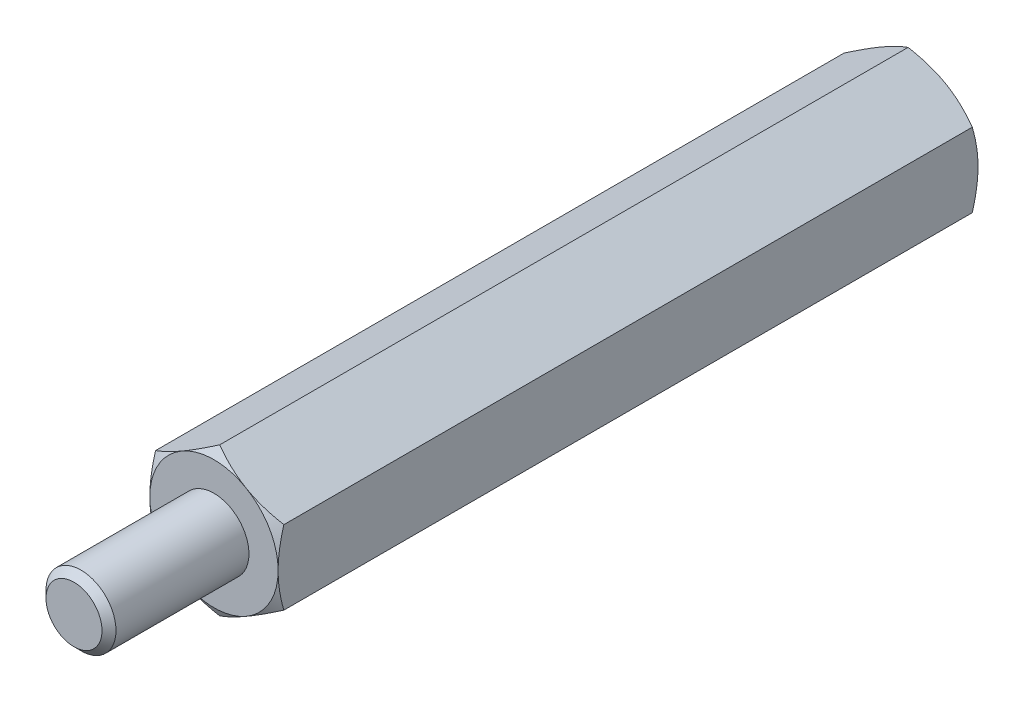
ISO-10303-21;
HEADER;
FILE_DESCRIPTION(('STEP AP214'),'2;1');
FILE_NAME('part.step','',(''),(''),'','','');
FILE_SCHEMA(('AUTOMOTIVE_DESIGN { 1 0 10303 214 1 1 1 1 }'));
ENDSEC;
DATA;
#1=APPLICATION_CONTEXT('core data for automotive mechanical design processes');
#2=APPLICATION_PROTOCOL_DEFINITION('international standard','automotive_design',2000,#1);
#3=PRODUCT_CONTEXT('',#1,'mechanical');
#4=PRODUCT('Part','Part','',(#3));
#5=PRODUCT_RELATED_PRODUCT_CATEGORY('part','',(#4));
#6=PRODUCT_DEFINITION_FORMATION('','',#4);
#7=PRODUCT_DEFINITION_CONTEXT('part definition',#1,'design');
#8=PRODUCT_DEFINITION('design','',#6,#7);
#9=PRODUCT_DEFINITION_SHAPE('','',#8);
#10=(LENGTH_UNIT() NAMED_UNIT(*) SI_UNIT(.MILLI.,.METRE.));
#11=(NAMED_UNIT(*) PLANE_ANGLE_UNIT() SI_UNIT($,.RADIAN.));
#12=(NAMED_UNIT(*) SI_UNIT($,.STERADIAN.) SOLID_ANGLE_UNIT());
#13=UNCERTAINTY_MEASURE_WITH_UNIT(LENGTH_MEASURE(1.E-05),#10,'distance_accuracy_value','');
#14=(GEOMETRIC_REPRESENTATION_CONTEXT(3) GLOBAL_UNCERTAINTY_ASSIGNED_CONTEXT((#13)) GLOBAL_UNIT_ASSIGNED_CONTEXT((#10,
#11,#12)) REPRESENTATION_CONTEXT('',''));
#15=CARTESIAN_POINT('',(0.,0.,0.));
#16=DIRECTION('',(0.,0.,1.));
#17=DIRECTION('',(1.,0.,0.));
#18=AXIS2_PLACEMENT_3D('',#15,#16,#17);
#19=CARTESIAN_POINT('',(0.,3.17542648054295,-30.));
#20=DIRECTION('',(-0.5,0.866025403784439,0.));
#21=DIRECTION('',(-0.866025403784439,-0.5,0.));
#22=AXIS2_PLACEMENT_3D('',#19,#20,#21);
#23=PLANE('',#22);
#24=DIRECTION('',(0.,0.,1.));
#25=VECTOR('',#24,1.);
#26=CARTESIAN_POINT('',(0.,3.17542648054295,-30.));
#27=LINE('',#26,#25);
#28=CARTESIAN_POINT('',(0.,3.17542648054295,-29.7543799069382));
#29=VERTEX_POINT('',#28);
#30=CARTESIAN_POINT('',(0.,3.17542648054295,-0.245620093061865));
#31=VERTEX_POINT('',#30);
#32=EDGE_CURVE('E247',#29,#31,#27,.T.);
#33=ORIENTED_EDGE('',*,*,#32,.F.);
#34=CARTESIAN_POINT('',(0.000199999999996883,3.17554195059678,-29.7543132366353));
#35=CARTESIAN_POINT('',(-0.120649220659911,3.10576962051743,-29.7946123377507));
#36=CARTESIAN_POINT('',(-0.242541602622639,3.03539502097908,-29.8312630974023));
#37=CARTESIAN_POINT('',(-0.488437126727897,2.89342717394439,-29.8952378170302));
#38=CARTESIAN_POINT('',(-0.612444638573859,2.82183140359859,-29.9225391443255));
#39=CARTESIAN_POINT('',(-0.858922797975946,2.67952717191843,-29.9650382547059));
#40=CARTESIAN_POINT('',(-0.98135551858742,2.60884060771578,-29.9805188813775));
#41=CARTESIAN_POINT('',(-1.22679714236892,2.46713482015519,-29.9990006026301));
#42=CARTESIAN_POINT('',(-1.34980515323291,2.39611611197038,-30.0020170005374));
#43=CARTESIAN_POINT('',(-1.57965878661079,2.26341005486545,-29.9957468545714));
#44=CARTESIAN_POINT('',(-1.68653879125402,2.20170285541369,-29.9879998457233));
#45=CARTESIAN_POINT('',(-1.89960246733475,2.07869048467395,-29.9634448189356));
#46=CARTESIAN_POINT('',(-2.00578540164889,2.01738573896434,-29.9466284103494));
#47=CARTESIAN_POINT('',(-2.21928848939319,1.89411967378235,-29.904588077654));
#48=CARTESIAN_POINT('',(-2.32658161614286,1.83217395817124,-29.8791859193128));
#49=CARTESIAN_POINT('',(-2.53956747928405,1.70920651275308,-29.82153277416));
#50=CARTESIAN_POINT('',(-2.64526294502665,1.64818320715447,-29.789295336701));
#51=CARTESIAN_POINT('',(-2.7502,1.58759777021763,-29.7543132366353));
#52=B_SPLINE_CURVE_WITH_KNOTS('',3,(#34,#35,#36,#37,#38,#39,#40,#41,#42,#43,#44,#45,#46,#47,#48,
#49,#50,#51),.UNSPECIFIED.,.F.,.F.,(4,2,2,2,2,2,2,2,4),(0.,0.435912828725886,0.872873557116327,
1.29901931904671,1.72464171213573,2.09526089052937,2.46622354066374,2.84541551798556,
3.22386274754523),.UNSPECIFIED.);
#53=CARTESIAN_POINT('',(-1.375,2.38156986040721,-30.));
#54=VERTEX_POINT('',#53);
#55=EDGE_CURVE('E249',#29,#54,#52,.T.);
#56=ORIENTED_EDGE('',*,*,#55,.T.);
#57=CARTESIAN_POINT('',(-2.75,1.58771324027147,-29.7543799069382));
#58=VERTEX_POINT('',#57);
#59=EDGE_CURVE('E184',#54,#58,#52,.T.);
#60=ORIENTED_EDGE('',*,*,#59,.T.);
#61=DIRECTION('',(0.,0.,1.));
#62=VECTOR('',#61,1.);
#63=CARTESIAN_POINT('',(-2.75,1.58771324027147,-30.));
#64=LINE('',#63,#62);
#65=CARTESIAN_POINT('',(-2.75,1.58771324027147,-0.245620093061863));
#66=VERTEX_POINT('',#65);
#67=EDGE_CURVE('E257',#58,#66,#64,.T.);
#68=ORIENTED_EDGE('',*,*,#67,.T.);
#69=CARTESIAN_POINT('',(-2.7502,1.58759777021763,-0.245686763364761));
#70=CARTESIAN_POINT('',(-2.6293507793401,1.65737010029699,-0.205387662249264));
#71=CARTESIAN_POINT('',(-2.50745839737737,1.72774469983534,-0.168736902597663));
#72=CARTESIAN_POINT('',(-2.26156287327211,1.86971254687003,-0.104762182969801));
#73=CARTESIAN_POINT('',(-2.13755536142615,1.94130831721583,-0.0774608556744979));
#74=CARTESIAN_POINT('',(-1.89107720202406,2.08361254889599,-0.0349617452941174));
#75=CARTESIAN_POINT('',(-1.76864448141259,2.15429911309865,-0.0194811186224586));
#76=CARTESIAN_POINT('',(-1.52320285763109,2.29600490065923,-0.000999397369941236));
#77=CARTESIAN_POINT('',(-1.40019484676709,2.36702360884404,0.00201700053739966));
#78=CARTESIAN_POINT('',(-1.17034121338921,2.49972966594897,-0.00425314542854719));
#79=CARTESIAN_POINT('',(-1.06346120874598,2.56143686540073,-0.0120001542767029));
#80=CARTESIAN_POINT('',(-0.850397532665254,2.68444923614047,-0.0365551810643553));
#81=CARTESIAN_POINT('',(-0.744214598351114,2.74575398185008,-0.0533715896505709));
#82=CARTESIAN_POINT('',(-0.53071151060682,2.86902004703207,-0.0954119223459568));
#83=CARTESIAN_POINT('',(-0.423418383857149,2.93096576264319,-0.120814080687231));
#84=CARTESIAN_POINT('',(-0.210432520715953,3.05393320806134,-0.178467225839982));
#85=CARTESIAN_POINT('',(-0.104737054973352,3.11495651365995,-0.210704663298982));
#86=CARTESIAN_POINT('',(0.000199999999996797,3.17554195059678,-0.24568676336476));
#87=B_SPLINE_CURVE_WITH_KNOTS('',3,(#69,#70,#71,#72,#73,#74,#75,#76,#77,#78,#79,#80,#81,#82,#83,
#84,#85,#86),.UNSPECIFIED.,.F.,.F.,(4,2,2,2,2,2,2,2,4),(0.,0.435912828725888,0.872873557116331,
1.29901931904671,1.72464171213573,2.09526089052937,2.46622354066374,2.84541551798557,
3.22386274754524),.UNSPECIFIED.);
#88=CARTESIAN_POINT('',(-1.375,2.38156986040721,0.));
#89=VERTEX_POINT('',#88);
#90=EDGE_CURVE('E269',#66,#89,#87,.T.);
#91=ORIENTED_EDGE('',*,*,#90,.T.);
#92=EDGE_CURVE('E252',#89,#31,#87,.T.);
#93=ORIENTED_EDGE('',*,*,#92,.T.);
#94=EDGE_LOOP('',(#33,#56,#60,#68,#91,#93));
#95=FACE_BOUND('',#94,.T.);
#96=ADVANCED_FACE('F17',(#95),#23,.T.);
#97=CARTESIAN_POINT('',(-2.75,1.58771324027147,-30.));
#98=DIRECTION('',(-1.,0.,0.));
#99=DIRECTION('',(0.,-1.,0.));
#100=AXIS2_PLACEMENT_3D('',#97,#98,#99);
#101=PLANE('',#100);
#102=ORIENTED_EDGE('',*,*,#67,.F.);
#103=CARTESIAN_POINT('',(-2.75,-4.21084949309676,-28.684051560397));
#104=CARTESIAN_POINT('',(-2.75,-4.0901089421409,-28.7424000638478));
#105=CARTESIAN_POINT('',(-2.75,-3.9690829206551,-28.8001685348824));
#106=CARTESIAN_POINT('',(-2.75,-3.72630558284844,-28.914213961577));
#107=CARTESIAN_POINT('',(-2.75,-3.60455414536201,-28.9704906589975));
#108=CARTESIAN_POINT('',(-2.75,-3.35951393034355,-29.0815175566472));
#109=CARTESIAN_POINT('',(-2.75,-3.23622034236437,-29.1362571783942));
#110=CARTESIAN_POINT('',(-2.75,-2.98861980138744,-29.2433852225235));
#111=CARTESIAN_POINT('',(-2.75,-2.86431290161183,-29.2957737674632));
#112=CARTESIAN_POINT('',(-2.75,-2.61294485887173,-29.3981964278539));
#113=CARTESIAN_POINT('',(-2.75,-2.48586863815655,-29.4481937421016));
#114=CARTESIAN_POINT('',(-2.75,-2.23021732171541,-29.5442725912154));
#115=CARTESIAN_POINT('',(-2.75,-2.10164206103364,-29.590353690423));
#116=CARTESIAN_POINT('',(-2.75,-1.84305218799468,-29.6773619229538));
#117=CARTESIAN_POINT('',(-2.75,-1.71304130052584,-29.7183000135861));
#118=CARTESIAN_POINT('',(-2.75,-1.45117125062148,-29.7936926923756));
#119=CARTESIAN_POINT('',(-2.75,-1.31931268690202,-29.8281493308472));
#120=CARTESIAN_POINT('',(-2.75,-1.05365722480012,-29.8889063284691));
#121=CARTESIAN_POINT('',(-2.75,-0.919859820217591,-29.9152045159049));
#122=CARTESIAN_POINT('',(-2.75,-0.650651874037381,-29.9578739628034));
#123=CARTESIAN_POINT('',(-2.75,-0.515241331013594,-29.9742452134895));
#124=CARTESIAN_POINT('',(-2.75,-0.244373242869209,-29.9956125034598));
#125=CARTESIAN_POINT('',(-2.75,-0.108921526377131,-30.0006805567732));
#126=CARTESIAN_POINT('',(-2.75,0.161887058855136,-29.9991722043673));
#127=CARTESIAN_POINT('',(-2.75,0.297243943089642,-29.9925988213144));
#128=CARTESIAN_POINT('',(-2.75,0.528385436717546,-29.9718958699531));
#129=CARTESIAN_POINT('',(-2.75,0.624425050137506,-29.9604623589698));
#130=CARTESIAN_POINT('',(-2.75,0.815762399811552,-29.9324782803867));
#131=CARTESIAN_POINT('',(-2.75,0.911060016631975,-29.9159269057723));
#132=CARTESIAN_POINT('',(-2.75,1.19576218748918,-29.8594646387217));
#133=CARTESIAN_POINT('',(-2.75,1.38383224738498,-29.8127601405827));
#134=CARTESIAN_POINT('',(-2.75,1.66525048947487,-29.7322075029694));
#135=CARTESIAN_POINT('',(-2.75,1.7600655624856,-29.7031966650045));
#136=CARTESIAN_POINT('',(-2.75,1.94870609382217,-29.6423043510934));
#137=CARTESIAN_POINT('',(-2.75,2.04253218553698,-29.6104248551215));
#138=CARTESIAN_POINT('',(-2.75,2.22880240354987,-29.5444585818135));
#139=CARTESIAN_POINT('',(-2.75,2.32125133588454,-29.5103852385445));
#140=CARTESIAN_POINT('',(-2.75,2.50543192042631,-29.4402386317689));
#141=CARTESIAN_POINT('',(-2.75,2.59716326539582,-29.4041645599627));
#142=CARTESIAN_POINT('',(-2.75,2.68856293053349,-29.3672875580025));
#143=B_SPLINE_CURVE_WITH_KNOTS('',3,(#103,#104,#105,#106,#107,#108,#109,#110,#111,#112,#113,
#114,#115,#116,#117,#118,#119,#120,#121,#122,#123,#124,#125,#126,#127,#128,#129,#130,#131,#132,
#133,#134,#135,#136,#137,#138,#139,#140,#141,#142),.UNSPECIFIED.,.F.,.F.,(4,2,2,2,2,2,2,2,2,2,2,
2,2,2,2,2,2,2,2,4),(0.,0.402305607365937,0.804680408537,1.20935783819118,1.61401414820819,
2.0236383818577,2.43330812457349,2.842089694796,3.25074173456637,3.65950246109144,
4.06826354901185,4.47441284024651,4.88045669141173,5.17046846817547,5.46052599902454,
6.04107275309885,6.33851131304664,6.63574613017458,6.93130791005796,7.22698998004827),.UNSPECIFIED.);
#144=CARTESIAN_POINT('',(-2.75,0.,-30.));
#145=VERTEX_POINT('',#144);
#146=EDGE_CURVE('E182',#58,#145,#143,.F.);
#147=ORIENTED_EDGE('',*,*,#146,.T.);
#148=CARTESIAN_POINT('',(-2.75,-1.58771324027147,-29.7543799069382));
#149=VERTEX_POINT('',#148);
#150=EDGE_CURVE('E176',#145,#149,#143,.F.);
#151=ORIENTED_EDGE('',*,*,#150,.T.);
#152=DIRECTION('',(0.,0.,1.));
#153=VECTOR('',#152,1.);
#154=CARTESIAN_POINT('',(-2.75,-1.58771324027147,-30.));
#155=LINE('',#154,#153);
#156=CARTESIAN_POINT('',(-2.75,-1.58771324027147,-0.245620093061863));
#157=VERTEX_POINT('',#156);
#158=EDGE_CURVE('E260',#149,#157,#155,.T.);
#159=ORIENTED_EDGE('',*,*,#158,.T.);
#160=CARTESIAN_POINT('',(-2.75,-4.21084949309675,-1.31594843960293));
#161=CARTESIAN_POINT('',(-2.75,-4.09010894214089,-1.25759993615223));
#162=CARTESIAN_POINT('',(-2.75,-3.96908292065509,-1.19983146511758));
#163=CARTESIAN_POINT('',(-2.75,-3.72630558284843,-1.08578603842304));
#164=CARTESIAN_POINT('',(-2.75,-3.604554145362,-1.02950934100246));
#165=CARTESIAN_POINT('',(-2.75,-3.35951393034354,-0.918482443352751));
#166=CARTESIAN_POINT('',(-2.75,-3.23622034236436,-0.863742821605832));
#167=CARTESIAN_POINT('',(-2.75,-2.98861980138743,-0.756614777476448));
#168=CARTESIAN_POINT('',(-2.75,-2.86431290161182,-0.704226232536758));
#169=CARTESIAN_POINT('',(-2.75,-2.61294485887172,-0.601803572146119));
#170=CARTESIAN_POINT('',(-2.75,-2.48586863815654,-0.551806257898389));
#171=CARTESIAN_POINT('',(-2.75,-2.2302173217154,-0.455727408784597));
#172=CARTESIAN_POINT('',(-2.75,-2.10164206103363,-0.409646309576967));
#173=CARTESIAN_POINT('',(-2.75,-1.84305218799467,-0.322638077046227));
#174=CARTESIAN_POINT('',(-2.75,-1.71304130052583,-0.281699986413884));
#175=CARTESIAN_POINT('',(-2.75,-1.45117125062147,-0.206307307624346));
#176=CARTESIAN_POINT('',(-2.75,-1.31931268690202,-0.171850669152766));
#177=CARTESIAN_POINT('',(-2.75,-1.05365722480012,-0.111093671530903));
#178=CARTESIAN_POINT('',(-2.75,-0.919859820217589,-0.0847954840951193));
#179=CARTESIAN_POINT('',(-2.75,-0.650651874037379,-0.0421260371966082));
#180=CARTESIAN_POINT('',(-2.75,-0.515241331013593,-0.0257547865105408));
#181=CARTESIAN_POINT('',(-2.75,-0.244373242869209,-0.00438749654023517));
#182=CARTESIAN_POINT('',(-2.75,-0.108921526377131,0.000680556773218912));
#183=CARTESIAN_POINT('',(-2.75,0.161887058855136,-0.000827795632671062));
#184=CARTESIAN_POINT('',(-2.75,0.297243943089643,-0.00740117868555545));
#185=CARTESIAN_POINT('',(-2.75,0.528385436717546,-0.028104130046845));
#186=CARTESIAN_POINT('',(-2.75,0.624425050137505,-0.0395376410301877));
#187=CARTESIAN_POINT('',(-2.75,0.81576239981155,-0.0675217196133494));
#188=CARTESIAN_POINT('',(-2.75,0.911060016631974,-0.0840730942276813));
#189=CARTESIAN_POINT('',(-2.75,1.19576218748917,-0.140535361278285));
#190=CARTESIAN_POINT('',(-2.75,1.38383224738498,-0.187239859417295));
#191=CARTESIAN_POINT('',(-2.75,1.66525048947487,-0.26779249703058));
#192=CARTESIAN_POINT('',(-2.75,1.76006556248559,-0.296803334995503));
#193=CARTESIAN_POINT('',(-2.75,1.94870609382217,-0.357695648906591));
#194=CARTESIAN_POINT('',(-2.75,2.04253218553698,-0.389575144878507));
#195=CARTESIAN_POINT('',(-2.75,2.22880240354986,-0.455541418186452));
#196=CARTESIAN_POINT('',(-2.75,2.32125133588453,-0.489614761455537));
#197=CARTESIAN_POINT('',(-2.75,2.50543192042631,-0.559761368231114));
#198=CARTESIAN_POINT('',(-2.75,2.59716326539581,-0.595835440037324));
#199=CARTESIAN_POINT('',(-2.75,2.68856293053348,-0.632712441997491));
#200=B_SPLINE_CURVE_WITH_KNOTS('',3,(#160,#161,#162,#163,#164,#165,#166,#167,#168,#169,#170,
#171,#172,#173,#174,#175,#176,#177,#178,#179,#180,#181,#182,#183,#184,#185,#186,#187,#188,#189,
#190,#191,#192,#193,#194,#195,#196,#197,#198,#199),.UNSPECIFIED.,.F.,.F.,(4,2,2,2,2,2,2,2,2,2,2,
2,2,2,2,2,2,2,2,4),(0.,0.402305607365936,0.804680408536996,1.20935783819118,1.61401414820818,
2.0236383818577,2.43330812457348,2.842089694796,3.25074173456636,3.65950246109143,
4.06826354901183,4.4744128402465,4.88045669141171,5.17046846817546,5.46052599902452,
6.04107275309884,6.33851131304662,6.63574613017456,6.93130791005794,7.22698998004824),.UNSPECIFIED.);
#201=CARTESIAN_POINT('',(-2.75,0.,0.));
#202=VERTEX_POINT('',#201);
#203=EDGE_CURVE('E205',#157,#202,#200,.T.);
#204=ORIENTED_EDGE('',*,*,#203,.T.);
#205=EDGE_CURVE('E199',#202,#66,#200,.T.);
#206=ORIENTED_EDGE('',*,*,#205,.T.);
#207=EDGE_LOOP('',(#102,#147,#151,#159,#204,#206));
#208=FACE_BOUND('',#207,.T.);
#209=ADVANCED_FACE('F190',(#208),#101,.T.);
#210=CARTESIAN_POINT('',(-2.75,-1.58771324027147,-30.));
#211=DIRECTION('',(-0.5,-0.866025403784438,0.));
#212=DIRECTION('',(0.866025403784439,-0.5,0.));
#213=AXIS2_PLACEMENT_3D('',#210,#211,#212);
#214=PLANE('',#213);
#215=ORIENTED_EDGE('',*,*,#158,.F.);
#216=CARTESIAN_POINT('',(-2.7502,-1.58759777021763,-29.7543132366353));
#217=CARTESIAN_POINT('',(-2.62935077934009,-1.65737010029699,-29.7946123377507));
#218=CARTESIAN_POINT('',(-2.50745839737736,-1.72774469983533,-29.8312630974023));
#219=CARTESIAN_POINT('',(-2.26156287327211,-1.86971254687003,-29.8952378170302));
#220=CARTESIAN_POINT('',(-2.13755536142614,-1.94130831721583,-29.9225391443255));
#221=CARTESIAN_POINT('',(-1.89107720202406,-2.08361254889599,-29.9650382547059));
#222=CARTESIAN_POINT('',(-1.76864448141258,-2.15429911309864,-29.9805188813775));
#223=CARTESIAN_POINT('',(-1.52320285763109,-2.29600490065923,-29.9990006026301));
#224=CARTESIAN_POINT('',(-1.40019484676709,-2.36702360884404,-30.0020170005374));
#225=CARTESIAN_POINT('',(-1.17034121338921,-2.49972966594897,-29.9957468545714));
#226=CARTESIAN_POINT('',(-1.06346120874598,-2.56143686540073,-29.9879998457233));
#227=CARTESIAN_POINT('',(-0.850397532665249,-2.68444923614047,-29.9634448189356));
#228=CARTESIAN_POINT('',(-0.74421459835111,-2.74575398185008,-29.9466284103494));
#229=CARTESIAN_POINT('',(-0.530711510606815,-2.86902004703206,-29.904588077654));
#230=CARTESIAN_POINT('',(-0.423418383857144,-2.93096576264318,-29.8791859193128));
#231=CARTESIAN_POINT('',(-0.210432520715948,-3.05393320806134,-29.82153277416));
#232=CARTESIAN_POINT('',(-0.104737054973347,-3.11495651365995,-29.789295336701));
#233=CARTESIAN_POINT('',(0.000200000000000226,-3.17554195059679,-29.7543132366353));
#234=B_SPLINE_CURVE_WITH_KNOTS('',3,(#216,#217,#218,#219,#220,#221,#222,#223,#224,#225,#226,
#227,#228,#229,#230,#231,#232,#233),.UNSPECIFIED.,.F.,.F.,(4,2,2,2,2,2,2,2,4),(0.,
0.435912828725887,0.872873557116327,1.29901931904671,1.72464171213573,2.09526089052937,
2.46622354066374,2.84541551798557,3.22386274754524),.UNSPECIFIED.);
#235=CARTESIAN_POINT('',(-1.375,-2.38156986040721,-30.));
#236=VERTEX_POINT('',#235);
#237=EDGE_CURVE('E183',#149,#236,#234,.T.);
#238=ORIENTED_EDGE('',*,*,#237,.T.);
#239=CARTESIAN_POINT('',(0.,-3.17542648054295,-29.7543799069382));
#240=VERTEX_POINT('',#239);
#241=EDGE_CURVE('E170',#236,#240,#234,.T.);
#242=ORIENTED_EDGE('',*,*,#241,.T.);
#243=DIRECTION('',(0.,0.,1.));
#244=VECTOR('',#243,1.);
#245=CARTESIAN_POINT('',(0.,-3.17542648054295,-30.));
#246=LINE('',#245,#244);
#247=CARTESIAN_POINT('',(0.,-3.17542648054295,-0.245620093061863));
#248=VERTEX_POINT('',#247);
#249=EDGE_CURVE('E275',#240,#248,#246,.T.);
#250=ORIENTED_EDGE('',*,*,#249,.T.);
#251=CARTESIAN_POINT('',(0.000200000000000498,-3.17554195059679,-0.245686763364761));
#252=CARTESIAN_POINT('',(-0.120649220659904,-3.10576962051743,-0.205387662249263));
#253=CARTESIAN_POINT('',(-0.242541602622632,-3.03539502097908,-0.168736902597661));
#254=CARTESIAN_POINT('',(-0.48843712672789,-2.89342717394439,-0.1047621829698));
#255=CARTESIAN_POINT('',(-0.612444638573853,-2.82183140359858,-0.077460855674496));
#256=CARTESIAN_POINT('',(-0.858922797975941,-2.67952717191843,-0.0349617452941148));
#257=CARTESIAN_POINT('',(-0.981355518587414,-2.60884060771577,-0.0194811186224553));
#258=CARTESIAN_POINT('',(-1.22679714236891,-2.46713482015519,-0.000999397369939396));
#259=CARTESIAN_POINT('',(-1.34980515323291,-2.39611611197038,0.00201700053739939));
#260=CARTESIAN_POINT('',(-1.57965878661079,-2.26341005486544,-0.0042531454285471));
#261=CARTESIAN_POINT('',(-1.68653879125402,-2.20170285541369,-0.0120001542767009));
#262=CARTESIAN_POINT('',(-1.89960246733475,-2.07869048467395,-0.0365551810643519));
#263=CARTESIAN_POINT('',(-2.00578540164889,-2.01738573896433,-0.0533715896505679));
#264=CARTESIAN_POINT('',(-2.21928848939318,-1.89411967378235,-0.0954119223459542));
#265=CARTESIAN_POINT('',(-2.32658161614285,-1.83217395817123,-0.120814080687228));
#266=CARTESIAN_POINT('',(-2.53956747928405,-1.70920651275308,-0.17846722583998));
#267=CARTESIAN_POINT('',(-2.64526294502665,-1.64818320715446,-0.210704663298981));
#268=CARTESIAN_POINT('',(-2.7502,-1.58759777021763,-0.24568676336476));
#269=B_SPLINE_CURVE_WITH_KNOTS('',3,(#251,#252,#253,#254,#255,#256,#257,#258,#259,#260,#261,
#262,#263,#264,#265,#266,#267,#268),.UNSPECIFIED.,.F.,.F.,(4,2,2,2,2,2,2,2,4),(0.,
0.435912828725889,0.872873557116333,1.29901931904672,1.72464171213574,2.09526089052938,
2.46622354066375,2.84541551798557,3.22386274754525),.UNSPECIFIED.);
#270=CARTESIAN_POINT('',(-1.375,-2.38156986040721,0.));
#271=VERTEX_POINT('',#270);
#272=EDGE_CURVE('E213',#248,#271,#269,.T.);
#273=ORIENTED_EDGE('',*,*,#272,.T.);
#274=EDGE_CURVE('E207',#271,#157,#269,.T.);
#275=ORIENTED_EDGE('',*,*,#274,.T.);
#276=EDGE_LOOP('',(#215,#238,#242,#250,#273,#275));
#277=FACE_BOUND('',#276,.T.);
#278=ADVANCED_FACE('F193',(#277),#214,.T.);
#279=CARTESIAN_POINT('',(0.,-3.17542648054295,-30.));
#280=DIRECTION('',(0.5,-0.866025403784439,0.));
#281=DIRECTION('',(0.866025403784439,0.5,0.));
#282=AXIS2_PLACEMENT_3D('',#279,#280,#281);
#283=PLANE('',#282);
#284=ORIENTED_EDGE('',*,*,#249,.F.);
#285=CARTESIAN_POINT('',(-0.000199999999999216,-3.17554195059678,-29.7543132366353));
#286=CARTESIAN_POINT('',(0.120649220659909,-3.10576962051743,-29.7946123377507));
#287=CARTESIAN_POINT('',(0.242541602622637,-3.03539502097908,-29.8312630974023));
#288=CARTESIAN_POINT('',(0.488437126727896,-2.89342717394439,-29.8952378170302));
#289=CARTESIAN_POINT('',(0.612444638573857,-2.82183140359859,-29.9225391443255));
#290=CARTESIAN_POINT('',(0.858922797975945,-2.67952717191843,-29.9650382547059));
#291=CARTESIAN_POINT('',(0.981355518587418,-2.60884060771577,-29.9805188813775));
#292=CARTESIAN_POINT('',(1.22679714236892,-2.46713482015519,-29.9990006026301));
#293=CARTESIAN_POINT('',(1.34980515323291,-2.39611611197038,-30.0020170005374));
#294=CARTESIAN_POINT('',(1.57965878661079,-2.26341005486545,-29.9957468545714));
#295=CARTESIAN_POINT('',(1.68653879125402,-2.20170285541369,-29.9879998457233));
#296=CARTESIAN_POINT('',(1.89960246733475,-2.07869048467395,-29.9634448189356));
#297=CARTESIAN_POINT('',(2.00578540164889,-2.01738573896434,-29.9466284103494));
#298=CARTESIAN_POINT('',(2.21928848939318,-1.89411967378235,-29.904588077654));
#299=CARTESIAN_POINT('',(2.32658161614285,-1.83217395817123,-29.8791859193128));
#300=CARTESIAN_POINT('',(2.53956747928405,-1.70920651275308,-29.82153277416));
#301=CARTESIAN_POINT('',(2.64526294502665,-1.64818320715447,-29.789295336701));
#302=CARTESIAN_POINT('',(2.7502,-1.58759777021764,-29.7543132366353));
#303=B_SPLINE_CURVE_WITH_KNOTS('',3,(#285,#286,#287,#288,#289,#290,#291,#292,#293,#294,#295,
#296,#297,#298,#299,#300,#301,#302),.UNSPECIFIED.,.F.,.F.,(4,2,2,2,2,2,2,2,4),(0.,
0.435912828725886,0.872873557116328,1.29901931904671,1.72464171213573,2.09526089052937,
2.46622354066374,2.84541551798557,3.22386274754523),.UNSPECIFIED.);
#304=CARTESIAN_POINT('',(1.375,-2.38156986040721,-30.));
#305=VERTEX_POINT('',#304);
#306=EDGE_CURVE('E40',#240,#305,#303,.T.);
#307=ORIENTED_EDGE('',*,*,#306,.T.);
#308=CARTESIAN_POINT('',(2.75,-1.58771324027148,-29.7543799069382));
#309=VERTEX_POINT('',#308);
#310=EDGE_CURVE('E136',#305,#309,#303,.T.);
#311=ORIENTED_EDGE('',*,*,#310,.T.);
#312=DIRECTION('',(0.,0.,1.));
#313=VECTOR('',#312,1.);
#314=CARTESIAN_POINT('',(2.75,-1.58771324027147,-30.));
#315=LINE('',#314,#313);
#316=CARTESIAN_POINT('',(2.75,-1.58771324027147,-0.245620093061863));
#317=VERTEX_POINT('',#316);
#318=EDGE_CURVE('E271',#309,#317,#315,.T.);
#319=ORIENTED_EDGE('',*,*,#318,.T.);
#320=CARTESIAN_POINT('',(2.7502,-1.58759777021764,-0.245686763364759));
#321=CARTESIAN_POINT('',(2.62935077934009,-1.65737010029699,-0.205387662249262));
#322=CARTESIAN_POINT('',(2.50745839737736,-1.72774469983534,-0.168736902597661));
#323=CARTESIAN_POINT('',(2.26156287327211,-1.86971254687003,-0.1047621829698));
#324=CARTESIAN_POINT('',(2.13755536142614,-1.94130831721583,-0.0774608556744968));
#325=CARTESIAN_POINT('',(1.89107720202405,-2.08361254889599,-0.0349617452941163));
#326=CARTESIAN_POINT('',(1.76864448141258,-2.15429911309865,-0.0194811186224573));
#327=CARTESIAN_POINT('',(1.52320285763108,-2.29600490065923,-0.000999397369940658));
#328=CARTESIAN_POINT('',(1.40019484676709,-2.36702360884404,0.00201700053739933));
#329=CARTESIAN_POINT('',(1.1703412133892,-2.49972966594897,-0.00425314542854791));
#330=CARTESIAN_POINT('',(1.06346120874598,-2.56143686540073,-0.0120001542767032));
#331=CARTESIAN_POINT('',(0.850397532665248,-2.68444923614047,-0.0365551810643553));
#332=CARTESIAN_POINT('',(0.744214598351109,-2.74575398185008,-0.0533715896505708));
#333=CARTESIAN_POINT('',(0.530711510606815,-2.86902004703207,-0.0954119223459568));
#334=CARTESIAN_POINT('',(0.423418383857144,-2.93096576264319,-0.120814080687231));
#335=CARTESIAN_POINT('',(0.210432520715948,-3.05393320806134,-0.178467225839982));
#336=CARTESIAN_POINT('',(0.104737054973347,-3.11495651365996,-0.210704663298983));
#337=CARTESIAN_POINT('',(-0.000199999999999721,-3.17554195059679,-0.245686763364761));
#338=B_SPLINE_CURVE_WITH_KNOTS('',3,(#320,#321,#322,#323,#324,#325,#326,#327,#328,#329,#330,
#331,#332,#333,#334,#335,#336,#337),.UNSPECIFIED.,.F.,.F.,(4,2,2,2,2,2,2,2,4),(0.,
0.435912828725888,0.872873557116333,1.29901931904672,1.72464171213574,2.09526089052938,
2.46622354066374,2.84541551798557,3.22386274754524),.UNSPECIFIED.);
#339=CARTESIAN_POINT('',(1.375,-2.38156986040721,0.));
#340=VERTEX_POINT('',#339);
#341=EDGE_CURVE('E220',#317,#340,#338,.T.);
#342=ORIENTED_EDGE('',*,*,#341,.T.);
#343=EDGE_CURVE('E214',#340,#248,#338,.T.);
#344=ORIENTED_EDGE('',*,*,#343,.T.);
#345=EDGE_LOOP('',(#284,#307,#311,#319,#342,#344));
#346=FACE_BOUND('',#345,.T.);
#347=ADVANCED_FACE('F226',(#346),#283,.T.);
#348=CARTESIAN_POINT('',(2.75,-1.58771324027147,-30.));
#349=DIRECTION('',(1.,0.,0.));
#350=DIRECTION('',(0.,1.,0.));
#351=AXIS2_PLACEMENT_3D('',#348,#349,#350);
#352=PLANE('',#351);
#353=ORIENTED_EDGE('',*,*,#318,.F.);
#354=CARTESIAN_POINT('',(2.75,-4.21084949309675,-28.684051560397));
#355=CARTESIAN_POINT('',(2.75,-4.0901089421409,-28.7424000638478));
#356=CARTESIAN_POINT('',(2.75,-3.96908292065509,-28.8001685348824));
#357=CARTESIAN_POINT('',(2.75,-3.72630558284844,-28.914213961577));
#358=CARTESIAN_POINT('',(2.75,-3.604554145362,-28.9704906589975));
#359=CARTESIAN_POINT('',(2.75,-3.35951393034355,-29.0815175566472));
#360=CARTESIAN_POINT('',(2.75,-3.23622034236437,-29.1362571783942));
#361=CARTESIAN_POINT('',(2.75,-2.98861980138744,-29.2433852225235));
#362=CARTESIAN_POINT('',(2.75,-2.86431290161182,-29.2957737674632));
#363=CARTESIAN_POINT('',(2.75,-2.61294485887172,-29.3981964278539));
#364=CARTESIAN_POINT('',(2.75,-2.48586863815655,-29.4481937421016));
#365=CARTESIAN_POINT('',(2.75,-2.23021732171541,-29.5442725912154));
#366=CARTESIAN_POINT('',(2.75,-2.10164206103364,-29.590353690423));
#367=CARTESIAN_POINT('',(2.75,-1.84305218799468,-29.6773619229538));
#368=CARTESIAN_POINT('',(2.75,-1.71304130052584,-29.7183000135861));
#369=CARTESIAN_POINT('',(2.75,-1.45117125062148,-29.7936926923756));
#370=CARTESIAN_POINT('',(2.75,-1.31931268690202,-29.8281493308472));
#371=CARTESIAN_POINT('',(2.75,-1.05365722480013,-29.8889063284691));
#372=CARTESIAN_POINT('',(2.75,-0.919859820217594,-29.9152045159049));
#373=CARTESIAN_POINT('',(2.75,-0.650651874037385,-29.9578739628034));
#374=CARTESIAN_POINT('',(2.75,-0.515241331013598,-29.9742452134895));
#375=CARTESIAN_POINT('',(2.75,-0.244373242869214,-29.9956125034598));
#376=CARTESIAN_POINT('',(2.75,-0.108921526377137,-30.0006805567732));
#377=CARTESIAN_POINT('',(2.75,0.16188705885513,-29.9991722043673));
#378=CARTESIAN_POINT('',(2.75,0.297243943089635,-29.9925988213144));
#379=CARTESIAN_POINT('',(2.75,0.528385436717539,-29.9718958699531));
#380=CARTESIAN_POINT('',(2.75,0.624425050137499,-29.9604623589698));
#381=CARTESIAN_POINT('',(2.75,0.815762399811544,-29.9324782803867));
#382=CARTESIAN_POINT('',(2.75,0.911060016631967,-29.9159269057723));
#383=CARTESIAN_POINT('',(2.75,1.19576218748917,-29.8594646387217));
#384=CARTESIAN_POINT('',(2.75,1.38383224738497,-29.8127601405827));
#385=CARTESIAN_POINT('',(2.75,1.66525048947486,-29.7322075029694));
#386=CARTESIAN_POINT('',(2.75,1.76006556248559,-29.7031966650045));
#387=CARTESIAN_POINT('',(2.75,1.94870609382216,-29.6423043510934));
#388=CARTESIAN_POINT('',(2.75,2.04253218553697,-29.6104248551215));
#389=CARTESIAN_POINT('',(2.75,2.22880240354986,-29.5444585818135));
#390=CARTESIAN_POINT('',(2.75,2.32125133588453,-29.5103852385445));
#391=CARTESIAN_POINT('',(2.75,2.5054319204263,-29.4402386317689));
#392=CARTESIAN_POINT('',(2.75,2.5971632653958,-29.4041645599627));
#393=CARTESIAN_POINT('',(2.75,2.68856293053347,-29.3672875580025));
#394=B_SPLINE_CURVE_WITH_KNOTS('',3,(#354,#355,#356,#357,#358,#359,#360,#361,#362,#363,#364,
#365,#366,#367,#368,#369,#370,#371,#372,#373,#374,#375,#376,#377,#378,#379,#380,#381,#382,#383,
#384,#385,#386,#387,#388,#389,#390,#391,#392,#393),.UNSPECIFIED.,.F.,.F.,(4,2,2,2,2,2,2,2,2,2,2,
2,2,2,2,2,2,2,2,4),(0.,0.402305607365936,0.804680408536998,1.20935783819118,1.61401414820818,
2.0236383818577,2.43330812457348,2.842089694796,3.25074173456636,3.65950246109143,
4.06826354901184,4.4744128402465,4.88045669141172,5.17046846817546,5.46052599902452,
6.04107275309884,6.33851131304662,6.63574613017456,6.93130791005794,7.22698998004824),.UNSPECIFIED.);
#395=CARTESIAN_POINT('',(2.75,0.,-30.));
#396=VERTEX_POINT('',#395);
#397=EDGE_CURVE('E135',#309,#396,#394,.T.);
#398=ORIENTED_EDGE('',*,*,#397,.T.);
#399=CARTESIAN_POINT('',(2.75,1.58771324027147,-29.7543799069382));
#400=VERTEX_POINT('',#399);
#401=EDGE_CURVE('E127',#396,#400,#394,.T.);
#402=ORIENTED_EDGE('',*,*,#401,.T.);
#403=DIRECTION('',(0.,0.,1.));
#404=VECTOR('',#403,1.);
#405=CARTESIAN_POINT('',(2.75,1.58771324027147,-30.));
#406=LINE('',#405,#404);
#407=CARTESIAN_POINT('',(2.75,1.58771324027149,-0.245620093061863));
#408=VERTEX_POINT('',#407);
#409=EDGE_CURVE('E270',#400,#408,#406,.T.);
#410=ORIENTED_EDGE('',*,*,#409,.T.);
#411=CARTESIAN_POINT('',(2.75,-4.21085047466775,-1.31594891408978));
#412=CARTESIAN_POINT('',(2.75,-4.09010989011095,-1.25760039033708));
#413=CARTESIAN_POINT('',(2.75,-3.96908383499853,-1.19983189901236));
#414=CARTESIAN_POINT('',(2.75,-3.72630642982622,-1.08578643184575));
#415=CARTESIAN_POINT('',(2.75,-3.60455495860072,-1.02950971424319));
#416=CARTESIAN_POINT('',(2.75,-3.35951467553998,-0.918482776219323));
#417=CARTESIAN_POINT('',(2.75,-3.23622105325521,-0.86374313428454));
#418=CARTESIAN_POINT('',(2.75,-2.98862044341193,-0.756615050150911));
#419=CARTESIAN_POINT('',(2.75,-2.86431350907558,-0.704226485394799));
#420=CARTESIAN_POINT('',(2.75,-2.61294539628323,-0.601803785712128));
#421=CARTESIAN_POINT('',(2.75,-2.48586914007059,-0.551806451999393));
#422=CARTESIAN_POINT('',(2.75,-2.23021775204037,-0.455727565035134));
#423=CARTESIAN_POINT('',(2.75,-2.10164245526681,-0.409646447442424));
#424=CARTESIAN_POINT('',(2.75,-1.84305250936246,-0.32263817997197));
#425=CARTESIAN_POINT('',(2.75,-1.71304158512251,-0.281700072779026));
#426=CARTESIAN_POINT('',(2.75,-1.45117146066374,-0.206307363670481));
#427=CARTESIAN_POINT('',(2.75,-1.31931285916159,-0.171850711438672));
#428=CARTESIAN_POINT('',(2.75,-1.05365730058872,-0.111093685978182));
#429=CARTESIAN_POINT('',(2.75,-0.919859837035222,-0.0847954856766154));
#430=CARTESIAN_POINT('',(2.75,-0.650651771588406,-0.0421260220404224));
#431=CARTESIAN_POINT('',(2.75,-0.515241168270031,-0.0257547674760023));
#432=CARTESIAN_POINT('',(2.75,-0.244372959827892,-0.00438748036256598));
#433=CARTESIAN_POINT('',(2.75,-0.108921183336607,0.00068056630442402));
#434=CARTESIAN_POINT('',(2.75,0.161887520872983,-0.000827809639778932));
#435=CARTESIAN_POINT('',(2.75,0.297244464085855,-0.00740120958678839));
#436=CARTESIAN_POINT('',(2.75,0.528386033126788,-0.0281041947704378));
#437=CARTESIAN_POINT('',(2.75,0.624425663637135,-0.039537719291154));
#438=CARTESIAN_POINT('',(2.75,0.815763046773993,-0.0675218256946248));
#439=CARTESIAN_POINT('',(2.75,0.911060679966728,-0.0840732145920173));
#440=CARTESIAN_POINT('',(2.75,1.19576289915275,-0.140535524839016));
#441=CARTESIAN_POINT('',(2.75,1.38383299011473,-0.187240052210044));
#442=CARTESIAN_POINT('',(2.75,1.66525127863566,-0.267792733064845));
#443=CARTESIAN_POINT('',(2.75,1.76006636738014,-0.296803585547788));
#444=CARTESIAN_POINT('',(2.75,1.94870693000559,-0.357695928076046));
#445=CARTESIAN_POINT('',(2.75,2.04253303727577,-0.38957543814692));
#446=CARTESIAN_POINT('',(2.75,2.2288032861738,-0.455541739100756));
#447=CARTESIAN_POINT('',(2.75,2.32125223383931,-0.489615095917168));
#448=CARTESIAN_POINT('',(2.75,2.50543284907627,-0.559761729379373));
#449=CARTESIAN_POINT('',(2.75,2.59716420940989,-0.595835814325313));
#450=CARTESIAN_POINT('',(2.75,2.68856388993764,-0.63271282922334));
#451=B_SPLINE_CURVE_WITH_KNOTS('',3,(#411,#412,#413,#414,#415,#416,#417,#418,#419,#420,#421,
#422,#423,#424,#425,#426,#427,#428,#429,#430,#431,#432,#433,#434,#435,#436,#437,#438,#439,#440,
#441,#442,#443,#444,#445,#446,#447,#448,#449,#450),.UNSPECIFIED.,.F.,.F.,(4,2,2,2,2,2,2,2,2,2,2,
2,2,2,2,2,2,2,2,4),(0.,0.402305724628122,0.804680643080822,1.20935819137344,1.61401462001939,
2.02363897413607,2.43330883735974,2.8420905276564,3.2507426874035,3.6595035945605,
4.06826486284692,4.47441433252272,4.88045836225495,5.17047019471949,5.46052778127857,
6.04107464708556,6.33851326493237,6.63574813987143,6.93130997697812,7.22699210430479),.UNSPECIFIED.);
#452=CARTESIAN_POINT('',(2.75,0.,0.));
#453=VERTEX_POINT('',#452);
#454=EDGE_CURVE('E321',#408,#453,#451,.F.);
#455=ORIENTED_EDGE('',*,*,#454,.T.);
#456=EDGE_CURVE('E221',#453,#317,#451,.F.);
#457=ORIENTED_EDGE('',*,*,#456,.T.);
#458=EDGE_LOOP('',(#353,#398,#402,#410,#455,#457));
#459=FACE_BOUND('',#458,.T.);
#460=ADVANCED_FACE('F142',(#459),#352,.T.);
#461=CARTESIAN_POINT('',(2.75,1.58771324027147,-30.));
#462=DIRECTION('',(0.5,0.866025403784439,0.));
#463=DIRECTION('',(-0.866025403784439,0.5,0.));
#464=AXIS2_PLACEMENT_3D('',#461,#462,#463);
#465=PLANE('',#464);
#466=ORIENTED_EDGE('',*,*,#409,.F.);
#467=CARTESIAN_POINT('',(2.7502,1.58759777021763,-29.7543132366353));
#468=CARTESIAN_POINT('',(2.62935077934009,1.65737010029699,-29.7946123377507));
#469=CARTESIAN_POINT('',(2.50745839737736,1.72774469983534,-29.8312630974023));
#470=CARTESIAN_POINT('',(2.26156287327211,1.86971254687003,-29.8952378170302));
#471=CARTESIAN_POINT('',(2.13755536142614,1.94130831721583,-29.9225391443255));
#472=CARTESIAN_POINT('',(1.89107720202406,2.08361254889599,-29.9650382547059));
#473=CARTESIAN_POINT('',(1.76864448141258,2.15429911309865,-29.9805188813775));
#474=CARTESIAN_POINT('',(1.52320285763108,2.29600490065923,-29.9990006026301));
#475=CARTESIAN_POINT('',(1.40019484676709,2.36702360884404,-30.0020170005374));
#476=CARTESIAN_POINT('',(1.1703412133892,2.49972966594897,-29.9957468545714));
#477=CARTESIAN_POINT('',(1.06346120874598,2.56143686540073,-29.9879998457233));
#478=CARTESIAN_POINT('',(0.85039753266525,2.68444923614047,-29.9634448189356));
#479=CARTESIAN_POINT('',(0.74421459835111,2.74575398185008,-29.9466284103494));
#480=CARTESIAN_POINT('',(0.530711510606816,2.86902004703207,-29.904588077654));
#481=CARTESIAN_POINT('',(0.423418383857146,2.93096576264319,-29.8791859193128));
#482=CARTESIAN_POINT('',(0.21043252071595,3.05393320806134,-29.82153277416));
#483=CARTESIAN_POINT('',(0.104737054973348,3.11495651365995,-29.789295336701));
#484=CARTESIAN_POINT('',(-0.000200000000002835,3.17554195059678,-29.7543132366353));
#485=B_SPLINE_CURVE_WITH_KNOTS('',3,(#467,#468,#469,#470,#471,#472,#473,#474,#475,#476,#477,
#478,#479,#480,#481,#482,#483,#484),.UNSPECIFIED.,.F.,.F.,(4,2,2,2,2,2,2,2,4),(0.,
0.435912828725887,0.872873557116329,1.29901931904671,1.72464171213573,2.09526089052937,
2.46622354066374,2.84541551798557,3.22386274754524),.UNSPECIFIED.);
#486=CARTESIAN_POINT('',(1.375,2.38156986040721,-30.));
#487=VERTEX_POINT('',#486);
#488=EDGE_CURVE('E348',#400,#487,#485,.T.);
#489=ORIENTED_EDGE('',*,*,#488,.T.);
#490=EDGE_CURVE('E159',#487,#29,#485,.T.);
#491=ORIENTED_EDGE('',*,*,#490,.T.);
#492=ORIENTED_EDGE('',*,*,#32,.T.);
#493=CARTESIAN_POINT('',(-0.000200000000003116,3.17554195059678,-0.245686763364759));
#494=CARTESIAN_POINT('',(0.120649220659905,3.10576962051743,-0.205387662249263));
#495=CARTESIAN_POINT('',(0.242541602622633,3.03539502097908,-0.168736902597662));
#496=CARTESIAN_POINT('',(0.488437126727892,2.89342717394439,-0.104762182969801));
#497=CARTESIAN_POINT('',(0.612444638573854,2.82183140359859,-0.0774608556744978));
#498=CARTESIAN_POINT('',(0.858922797975943,2.67952717191843,-0.0349617452941172));
#499=CARTESIAN_POINT('',(0.981355518587416,2.60884060771578,-0.0194811186224583));
#500=CARTESIAN_POINT('',(1.22679714236891,2.46713482015519,-0.000999397369940431));
#501=CARTESIAN_POINT('',(1.34980515323291,2.39611611197038,0.00201700053740089));
#502=CARTESIAN_POINT('',(1.57965878661079,2.26341005486545,-0.00425314542854592));
#503=CARTESIAN_POINT('',(1.68653879125402,2.20170285541369,-0.0120001542767019));
#504=CARTESIAN_POINT('',(1.89960246733475,2.07869048467395,-0.0365551810643545));
#505=CARTESIAN_POINT('',(2.00578540164889,2.01738573896434,-0.0533715896505698));
#506=CARTESIAN_POINT('',(2.21928848939318,1.89411967378235,-0.0954119223459558));
#507=CARTESIAN_POINT('',(2.32658161614285,1.83217395817123,-0.12081408068723));
#508=CARTESIAN_POINT('',(2.53956747928405,1.70920651275308,-0.178467225839981));
#509=CARTESIAN_POINT('',(2.64526294502665,1.64818320715446,-0.210704663298981));
#510=CARTESIAN_POINT('',(2.7502,1.58759777021763,-0.245686763364757));
#511=B_SPLINE_CURVE_WITH_KNOTS('',3,(#493,#494,#495,#496,#497,#498,#499,#500,#501,#502,#503,
#504,#505,#506,#507,#508,#509,#510),.UNSPECIFIED.,.F.,.F.,(4,2,2,2,2,2,2,2,4),(0.,
0.435912828725888,0.872873557116331,1.29901931904671,1.72464171213573,2.09526089052938,
2.46622354066374,2.84541551798557,3.22386274754524),.UNSPECIFIED.);
#512=CARTESIAN_POINT('',(1.375,2.38156986040721,0.));
#513=VERTEX_POINT('',#512);
#514=EDGE_CURVE('E263',#31,#513,#511,.T.);
#515=ORIENTED_EDGE('',*,*,#514,.T.);
#516=EDGE_CURVE('E322',#513,#408,#511,.T.);
#517=ORIENTED_EDGE('',*,*,#516,.T.);
#518=EDGE_LOOP('',(#466,#489,#491,#492,#515,#517));
#519=FACE_BOUND('',#518,.T.);
#520=ADVANCED_FACE('F236',(#519),#465,.T.);
#521=CARTESIAN_POINT('',(0.,3.17542648054294,0.));
#522=DIRECTION('',(0.,0.,1.));
#523=DIRECTION('',(1.,0.,0.));
#524=AXIS2_PLACEMENT_3D('',#521,#522,#523);
#525=PLANE('',#524);
#526=CARTESIAN_POINT('',(0.,0.,0.));
#527=DIRECTION('',(0.,0.,1.));
#528=DIRECTION('',(1.,0.,0.));
#529=AXIS2_PLACEMENT_3D('',#526,#527,#528);
#530=CIRCLE('',#529,1.5);
#531=CARTESIAN_POINT('',(1.5,0.,0.));
#532=VERTEX_POINT('',#531);
#533=EDGE_CURVE('E258',#532,#532,#530,.T.);
#534=ORIENTED_EDGE('',*,*,#533,.F.);
#535=EDGE_LOOP('',(#534));
#536=FACE_BOUND('',#535,.T.);
#537=CARTESIAN_POINT('',(0.,0.,0.));
#538=DIRECTION('',(0.,0.,-1.));
#539=DIRECTION('',(-1.,0.,0.));
#540=AXIS2_PLACEMENT_3D('',#537,#538,#539);
#541=CIRCLE('',#540,2.75);
#542=EDGE_CURVE('E303',#453,#340,#541,.T.);
#543=ORIENTED_EDGE('',*,*,#542,.F.);
#544=EDGE_CURVE('E307',#513,#453,#541,.T.);
#545=ORIENTED_EDGE('',*,*,#544,.F.);
#546=EDGE_CURVE('E304',#89,#513,#541,.T.);
#547=ORIENTED_EDGE('',*,*,#546,.F.);
#548=EDGE_CURVE('E206',#202,#89,#541,.T.);
#549=ORIENTED_EDGE('',*,*,#548,.F.);
#550=EDGE_CURVE('E291',#271,#202,#541,.T.);
#551=ORIENTED_EDGE('',*,*,#550,.F.);
#552=EDGE_CURVE('E301',#340,#271,#541,.T.);
#553=ORIENTED_EDGE('',*,*,#552,.F.);
#554=EDGE_LOOP('',(#543,#545,#547,#549,#551,#553));
#555=FACE_BOUND('',#554,.T.);
#556=ADVANCED_FACE('F300',(#536,#555),#525,.T.);
#557=CARTESIAN_POINT('',(0.,0.,6.));
#558=DIRECTION('',(0.,0.,-1.));
#559=DIRECTION('',(-1.,0.,0.));
#560=AXIS2_PLACEMENT_3D('',#557,#558,#559);
#561=CYLINDRICAL_SURFACE('',#560,1.5);
#562=CARTESIAN_POINT('',(0.,0.,5.7));
#563=DIRECTION('',(0.,0.,1.));
#564=DIRECTION('',(1.,0.,0.));
#565=AXIS2_PLACEMENT_3D('',#562,#563,#564);
#566=CIRCLE('',#565,1.5);
#567=CARTESIAN_POINT('',(1.5,0.,5.7));
#568=VERTEX_POINT('',#567);
#569=EDGE_CURVE('E11',#568,#568,#566,.F.);
#570=ORIENTED_EDGE('',*,*,#569,.T.);
#571=EDGE_LOOP('',(#570));
#572=FACE_BOUND('',#571,.T.);
#573=ORIENTED_EDGE('',*,*,#533,.T.);
#574=EDGE_LOOP('',(#573));
#575=FACE_BOUND('',#574,.T.);
#576=ADVANCED_FACE('F358',(#572,#575),#561,.T.);
#577=CARTESIAN_POINT('',(0.,0.,6.));
#578=DIRECTION('',(0.,0.,1.));
#579=DIRECTION('',(1.,0.,0.));
#580=AXIS2_PLACEMENT_3D('',#577,#578,#579);
#581=PLANE('',#580);
#582=CARTESIAN_POINT('',(0.,0.,6.));
#583=DIRECTION('',(0.,0.,1.));
#584=DIRECTION('',(1.,0.,0.));
#585=AXIS2_PLACEMENT_3D('',#582,#583,#584);
#586=CIRCLE('',#585,1.2);
#587=CARTESIAN_POINT('',(1.2,0.,6.));
#588=VERTEX_POINT('',#587);
#589=EDGE_CURVE('E25',#588,#588,#586,.T.);
#590=ORIENTED_EDGE('',*,*,#589,.T.);
#591=EDGE_LOOP('',(#590));
#592=FACE_BOUND('',#591,.T.);
#593=ADVANCED_FACE('F354',(#592),#581,.T.);
#594=CARTESIAN_POINT('',(0.,0.,-0.245620093061863));
#595=DIRECTION('',(0.,0.,-1.));
#596=DIRECTION('',(-1.,0.,0.));
#597=AXIS2_PLACEMENT_3D('',#594,#595,#596);
#598=CONICAL_SURFACE('',#597,3.17542648054295,1.0471975511966);
#599=ORIENTED_EDGE('',*,*,#92,.F.);
#600=ORIENTED_EDGE('',*,*,#546,.T.);
#601=ORIENTED_EDGE('',*,*,#514,.F.);
#602=EDGE_LOOP('',(#599,#600,#601));
#603=FACE_BOUND('',#602,.T.);
#604=ADVANCED_FACE('F357',(#603),#598,.T.);
#605=ORIENTED_EDGE('',*,*,#548,.T.);
#606=ORIENTED_EDGE('',*,*,#90,.F.);
#607=ORIENTED_EDGE('',*,*,#205,.F.);
#608=EDGE_LOOP('',(#605,#606,#607));
#609=FACE_BOUND('',#608,.T.);
#610=ADVANCED_FACE('F153',(#609),#598,.T.);
#611=ORIENTED_EDGE('',*,*,#550,.T.);
#612=ORIENTED_EDGE('',*,*,#203,.F.);
#613=ORIENTED_EDGE('',*,*,#274,.F.);
#614=EDGE_LOOP('',(#611,#612,#613));
#615=FACE_BOUND('',#614,.T.);
#616=ADVANCED_FACE('F288',(#615),#598,.T.);
#617=ORIENTED_EDGE('',*,*,#552,.T.);
#618=ORIENTED_EDGE('',*,*,#272,.F.);
#619=ORIENTED_EDGE('',*,*,#343,.F.);
#620=EDGE_LOOP('',(#617,#618,#619));
#621=FACE_BOUND('',#620,.T.);
#622=ADVANCED_FACE('F319',(#621),#598,.T.);
#623=ORIENTED_EDGE('',*,*,#542,.T.);
#624=ORIENTED_EDGE('',*,*,#341,.F.);
#625=ORIENTED_EDGE('',*,*,#456,.F.);
#626=EDGE_LOOP('',(#623,#624,#625));
#627=FACE_BOUND('',#626,.T.);
#628=ADVANCED_FACE('F316',(#627),#598,.T.);
#629=ORIENTED_EDGE('',*,*,#544,.T.);
#630=ORIENTED_EDGE('',*,*,#454,.F.);
#631=ORIENTED_EDGE('',*,*,#516,.F.);
#632=EDGE_LOOP('',(#629,#630,#631));
#633=FACE_BOUND('',#632,.T.);
#634=ADVANCED_FACE('F364',(#633),#598,.T.);
#635=CARTESIAN_POINT('',(0.,0.,-30.));
#636=DIRECTION('',(0.,0.,1.));
#637=DIRECTION('',(1.,0.,0.));
#638=AXIS2_PLACEMENT_3D('',#635,#636,#637);
#639=CONICAL_SURFACE('',#638,2.75,1.0471975511966);
#640=ORIENTED_EDGE('',*,*,#490,.F.);
#641=CARTESIAN_POINT('',(0.,0.,-30.));
#642=DIRECTION('',(0.,0.,-1.));
#643=DIRECTION('',(-1.,0.,0.));
#644=AXIS2_PLACEMENT_3D('',#641,#642,#643);
#645=CIRCLE('',#644,2.75);
#646=EDGE_CURVE('E32',#54,#487,#645,.T.);
#647=ORIENTED_EDGE('',*,*,#646,.F.);
#648=ORIENTED_EDGE('',*,*,#55,.F.);
#649=EDGE_LOOP('',(#640,#647,#648));
#650=FACE_BOUND('',#649,.T.);
#651=ADVANCED_FACE('F150',(#650),#639,.T.);
#652=EDGE_CURVE('E592',#487,#396,#645,.T.);
#653=ORIENTED_EDGE('',*,*,#652,.F.);
#654=ORIENTED_EDGE('',*,*,#488,.F.);
#655=ORIENTED_EDGE('',*,*,#401,.F.);
#656=EDGE_LOOP('',(#653,#654,#655));
#657=FACE_BOUND('',#656,.T.);
#658=ADVANCED_FACE('F145',(#657),#639,.T.);
#659=EDGE_CURVE('E591',#396,#305,#645,.T.);
#660=ORIENTED_EDGE('',*,*,#659,.F.);
#661=ORIENTED_EDGE('',*,*,#397,.F.);
#662=ORIENTED_EDGE('',*,*,#310,.F.);
#663=EDGE_LOOP('',(#660,#661,#662));
#664=FACE_BOUND('',#663,.T.);
#665=ADVANCED_FACE('F149',(#664),#639,.T.);
#666=EDGE_CURVE('E122',#305,#236,#645,.T.);
#667=ORIENTED_EDGE('',*,*,#666,.F.);
#668=ORIENTED_EDGE('',*,*,#306,.F.);
#669=ORIENTED_EDGE('',*,*,#241,.F.);
#670=EDGE_LOOP('',(#667,#668,#669));
#671=FACE_BOUND('',#670,.T.);
#672=ADVANCED_FACE('F460',(#671),#639,.T.);
#673=EDGE_CURVE('E119',#236,#145,#645,.T.);
#674=ORIENTED_EDGE('',*,*,#673,.F.);
#675=ORIENTED_EDGE('',*,*,#237,.F.);
#676=ORIENTED_EDGE('',*,*,#150,.F.);
#677=EDGE_LOOP('',(#674,#675,#676));
#678=FACE_BOUND('',#677,.T.);
#679=ADVANCED_FACE('F469',(#678),#639,.T.);
#680=EDGE_CURVE('E124',#145,#54,#645,.T.);
#681=ORIENTED_EDGE('',*,*,#680,.F.);
#682=ORIENTED_EDGE('',*,*,#146,.F.);
#683=ORIENTED_EDGE('',*,*,#59,.F.);
#684=EDGE_LOOP('',(#681,#682,#683));
#685=FACE_BOUND('',#684,.T.);
#686=ADVANCED_FACE('F369',(#685),#639,.T.);
#687=CARTESIAN_POINT('',(0.,3.17542648054294,-30.));
#688=DIRECTION('',(0.,0.,1.));
#689=DIRECTION('',(1.,0.,0.));
#690=AXIS2_PLACEMENT_3D('',#687,#688,#689);
#691=PLANE('',#690);
#692=CARTESIAN_POINT('',(0.,0.,-30.));
#693=DIRECTION('',(0.,0.,1.));
#694=DIRECTION('',(1.,0.,0.));
#695=AXIS2_PLACEMENT_3D('',#692,#693,#694);
#696=CIRCLE('',#695,1.55);
#697=CARTESIAN_POINT('',(1.55,0.,-30.));
#698=VERTEX_POINT('',#697);
#699=EDGE_CURVE('E344',#698,#698,#696,.T.);
#700=ORIENTED_EDGE('',*,*,#699,.T.);
#701=EDGE_LOOP('',(#700));
#702=FACE_BOUND('',#701,.T.);
#703=ORIENTED_EDGE('',*,*,#652,.T.);
#704=ORIENTED_EDGE('',*,*,#659,.T.);
#705=ORIENTED_EDGE('',*,*,#666,.T.);
#706=ORIENTED_EDGE('',*,*,#673,.T.);
#707=ORIENTED_EDGE('',*,*,#680,.T.);
#708=ORIENTED_EDGE('',*,*,#646,.T.);
#709=EDGE_LOOP('',(#703,#704,#705,#706,#707,#708));
#710=FACE_BOUND('',#709,.T.);
#711=ADVANCED_FACE('F113',(#702,#710),#691,.F.);
#712=CARTESIAN_POINT('',(0.,0.,-22.5));
#713=DIRECTION('',(0.,0.,-1.));
#714=DIRECTION('',(-1.,0.,0.));
#715=AXIS2_PLACEMENT_3D('',#712,#713,#714);
#716=CONICAL_SURFACE('',#715,1.25,1.02974425867665);
#717=CARTESIAN_POINT('',(0.,0.,-21.7489242262155));
#718=VERTEX_POINT('',#717);
#719=VERTEX_LOOP('',#718);
#720=FACE_BOUND('',#719,.T.);
#721=CARTESIAN_POINT('',(0.,0.,-22.5));
#722=DIRECTION('',(0.,0.,-1.));
#723=DIRECTION('',(-1.,0.,0.));
#724=AXIS2_PLACEMENT_3D('',#721,#722,#723);
#725=CIRCLE('',#724,1.25);
#726=CARTESIAN_POINT('',(-1.25,0.,-22.5));
#727=VERTEX_POINT('',#726);
#728=EDGE_CURVE('E117',#727,#727,#725,.T.);
#729=ORIENTED_EDGE('',*,*,#728,.T.);
#730=EDGE_LOOP('',(#729));
#731=FACE_BOUND('',#730,.T.);
#732=ADVANCED_FACE('F109',(#720,#731),#716,.F.);
#733=CARTESIAN_POINT('',(0.,0.,-30.));
#734=DIRECTION('',(0.,0.,-1.));
#735=DIRECTION('',(-1.,0.,0.));
#736=AXIS2_PLACEMENT_3D('',#733,#734,#735);
#737=CYLINDRICAL_SURFACE('',#736,1.25);
#738=CARTESIAN_POINT('',(0.,0.,-29.7));
#739=DIRECTION('',(0.,0.,1.));
#740=DIRECTION('',(1.,0.,0.));
#741=AXIS2_PLACEMENT_3D('',#738,#739,#740);
#742=CIRCLE('',#741,1.25);
#743=CARTESIAN_POINT('',(1.25,0.,-29.7));
#744=VERTEX_POINT('',#743);
#745=EDGE_CURVE('E347',#744,#744,#742,.F.);
#746=ORIENTED_EDGE('',*,*,#745,.T.);
#747=EDGE_LOOP('',(#746));
#748=FACE_BOUND('',#747,.T.);
#749=ORIENTED_EDGE('',*,*,#728,.F.);
#750=EDGE_LOOP('',(#749));
#751=FACE_BOUND('',#750,.T.);
#752=ADVANCED_FACE('F112',(#748,#751),#737,.F.);
#753=CARTESIAN_POINT('',(0.,0.,-29.7));
#754=DIRECTION('',(0.,0.,-1.));
#755=DIRECTION('',(-1.,0.,0.));
#756=AXIS2_PLACEMENT_3D('',#753,#754,#755);
#757=CONICAL_SURFACE('',#756,1.25,0.785398163397449);
#758=ORIENTED_EDGE('',*,*,#699,.F.);
#759=EDGE_LOOP('',(#758));
#760=FACE_BOUND('',#759,.T.);
#761=ORIENTED_EDGE('',*,*,#745,.F.);
#762=EDGE_LOOP('',(#761));
#763=FACE_BOUND('',#762,.T.);
#764=ADVANCED_FACE('F329',(#760,#763),#757,.F.);
#765=CARTESIAN_POINT('',(0.,0.,6.));
#766=DIRECTION('',(0.,0.,-1.));
#767=DIRECTION('',(-1.,0.,0.));
#768=AXIS2_PLACEMENT_3D('',#765,#766,#767);
#769=CONICAL_SURFACE('',#768,1.2,0.785398163397443);
#770=ORIENTED_EDGE('',*,*,#569,.F.);
#771=EDGE_LOOP('',(#770));
#772=FACE_BOUND('',#771,.T.);
#773=ORIENTED_EDGE('',*,*,#589,.F.);
#774=EDGE_LOOP('',(#773));
#775=FACE_BOUND('',#774,.T.);
#776=ADVANCED_FACE('F19',(#772,#775),#769,.T.);
#777=CLOSED_SHELL('',(#96,#209,#278,#347,#460,#520,#556,#576,#593,#604,#610,#616,#622,#628,#634,
#651,#658,#665,#672,#679,#686,#711,#732,#752,#764,#776));
#778=MANIFOLD_SOLID_BREP('B1',#777);
#779=ADVANCED_BREP_SHAPE_REPRESENTATION('',(#18,#778),#14);
#780=SHAPE_DEFINITION_REPRESENTATION(#9,#779);
ENDSEC;
END-ISO-10303-21;
